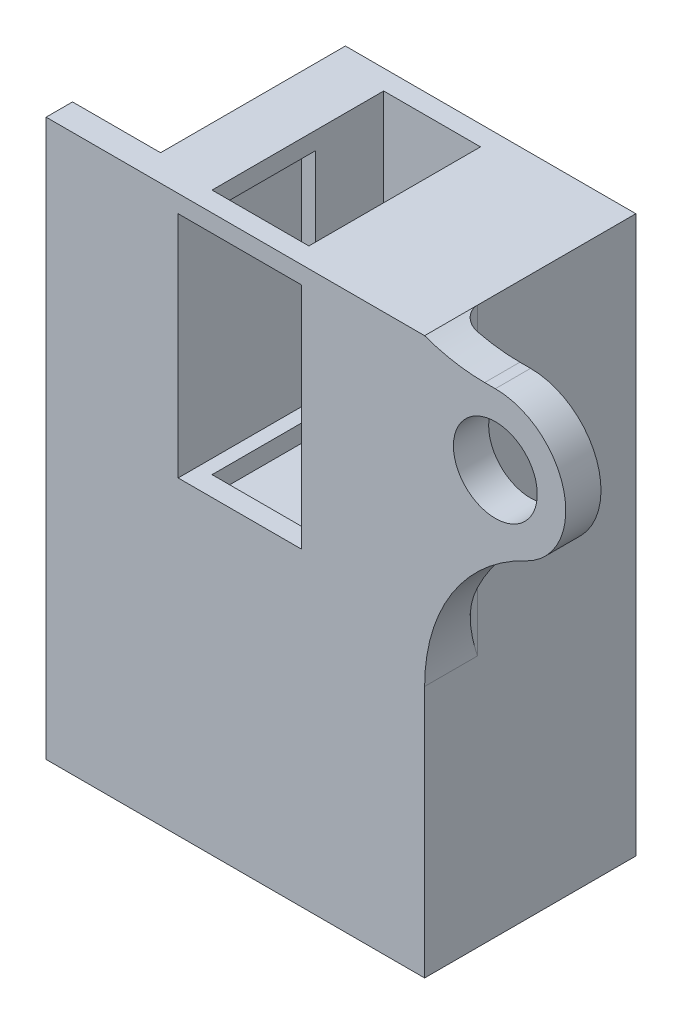
ISO-10303-21;
HEADER;
FILE_DESCRIPTION(('STEP AP214'),'2;1');
FILE_NAME('part.step','',(''),(''),'','','');
FILE_SCHEMA(('AUTOMOTIVE_DESIGN { 1 0 10303 214 1 1 1 1 }'));
ENDSEC;
DATA;
#1=APPLICATION_CONTEXT('core data for automotive mechanical design processes');
#2=APPLICATION_PROTOCOL_DEFINITION('international standard','automotive_design',2000,#1);
#3=PRODUCT_CONTEXT('',#1,'mechanical');
#4=PRODUCT('Part','Part','',(#3));
#5=PRODUCT_RELATED_PRODUCT_CATEGORY('part','',(#4));
#6=PRODUCT_DEFINITION_FORMATION('','',#4);
#7=PRODUCT_DEFINITION_CONTEXT('part definition',#1,'design');
#8=PRODUCT_DEFINITION('design','',#6,#7);
#9=PRODUCT_DEFINITION_SHAPE('','',#8);
#10=(LENGTH_UNIT() NAMED_UNIT(*) SI_UNIT(.MILLI.,.METRE.));
#11=(NAMED_UNIT(*) PLANE_ANGLE_UNIT() SI_UNIT($,.RADIAN.));
#12=(NAMED_UNIT(*) SI_UNIT($,.STERADIAN.) SOLID_ANGLE_UNIT());
#13=UNCERTAINTY_MEASURE_WITH_UNIT(LENGTH_MEASURE(1.E-05),#10,'distance_accuracy_value','');
#14=(GEOMETRIC_REPRESENTATION_CONTEXT(3) GLOBAL_UNCERTAINTY_ASSIGNED_CONTEXT((#13)) GLOBAL_UNIT_ASSIGNED_CONTEXT((#10,
#11,#12)) REPRESENTATION_CONTEXT('',''));
#15=CARTESIAN_POINT('',(0.,0.,0.));
#16=DIRECTION('',(0.,0.,1.));
#17=DIRECTION('',(1.,0.,0.));
#18=AXIS2_PLACEMENT_3D('',#15,#16,#17);
#19=CARTESIAN_POINT('',(0.,0.,-7.));
#20=DIRECTION('',(0.,0.,1.));
#21=DIRECTION('',(1.,0.,0.));
#22=AXIS2_PLACEMENT_3D('',#19,#20,#21);
#23=PLANE('',#22);
#24=DIRECTION('',(0.,-1.,0.));
#25=VECTOR('',#24,1.);
#26=CARTESIAN_POINT('',(3.3,0.,-7.));
#27=LINE('',#26,#25);
#28=CARTESIAN_POINT('',(3.3,32.6,-7.));
#29=VERTEX_POINT('',#28);
#30=CARTESIAN_POINT('',(3.3,19.6,-7.));
#31=VERTEX_POINT('',#30);
#32=EDGE_CURVE('E278',#29,#31,#27,.T.);
#33=ORIENTED_EDGE('',*,*,#32,.F.);
#34=DIRECTION('',(-1.,0.,0.));
#35=VECTOR('',#34,1.);
#36=CARTESIAN_POINT('',(0.,32.6,-7.));
#37=LINE('',#36,#35);
#38=CARTESIAN_POINT('',(2.5,32.6,-7.));
#39=VERTEX_POINT('',#38);
#40=EDGE_CURVE('E344',#29,#39,#37,.T.);
#41=ORIENTED_EDGE('',*,*,#40,.T.);
#42=DIRECTION('',(0.,-1.,0.));
#43=VECTOR('',#42,1.);
#44=CARTESIAN_POINT('',(2.50000000000001,0.,-7.));
#45=LINE('',#44,#43);
#46=CARTESIAN_POINT('',(2.5,19.6,-7.));
#47=VERTEX_POINT('',#46);
#48=EDGE_CURVE('E350',#39,#47,#45,.T.);
#49=ORIENTED_EDGE('',*,*,#48,.T.);
#50=DIRECTION('',(1.,0.,0.));
#51=VECTOR('',#50,1.);
#52=CARTESIAN_POINT('',(0.,19.6,-7.));
#53=LINE('',#52,#51);
#54=EDGE_CURVE('E355',#47,#31,#53,.T.);
#55=ORIENTED_EDGE('',*,*,#54,.T.);
#56=EDGE_LOOP('',(#33,#41,#49,#55));
#57=FACE_BOUND('',#56,.T.);
#58=ADVANCED_FACE('F42',(#57),#23,.T.);
#59=CARTESIAN_POINT('',(0.,0.,0.));
#60=DIRECTION('',(1.,0.,0.));
#61=DIRECTION('',(0.,0.,-1.));
#62=AXIS2_PLACEMENT_3D('',#59,#60,#61);
#63=PLANE('',#62);
#64=DIRECTION('',(0.,0.,1.));
#65=VECTOR('',#64,1.);
#66=CARTESIAN_POINT('',(0.,33.6,-12.));
#67=LINE('',#66,#65);
#68=CARTESIAN_POINT('',(0.,33.6,-12.));
#69=VERTEX_POINT('',#68);
#70=CARTESIAN_POINT('',(0.,33.6,-1.5));
#71=VERTEX_POINT('',#70);
#72=EDGE_CURVE('E303',#69,#71,#67,.T.);
#73=ORIENTED_EDGE('',*,*,#72,.F.);
#74=DIRECTION('',(0.,1.,0.));
#75=VECTOR('',#74,1.);
#76=CARTESIAN_POINT('',(0.,2.,-12.));
#77=LINE('',#76,#75);
#78=CARTESIAN_POINT('',(0.,2.,-12.));
#79=VERTEX_POINT('',#78);
#80=EDGE_CURVE('E287',#79,#69,#77,.T.);
#81=ORIENTED_EDGE('',*,*,#80,.F.);
#82=DIRECTION('',(0.,0.,1.));
#83=VECTOR('',#82,1.);
#84=CARTESIAN_POINT('',(0.,2.,-12.));
#85=LINE('',#84,#83);
#86=CARTESIAN_POINT('',(0.,2.,-1.5));
#87=VERTEX_POINT('',#86);
#88=EDGE_CURVE('E421',#79,#87,#85,.T.);
#89=ORIENTED_EDGE('',*,*,#88,.T.);
#90=DIRECTION('',(0.,-1.,0.));
#91=VECTOR('',#90,1.);
#92=CARTESIAN_POINT('',(0.,37.1,-1.5));
#93=LINE('',#92,#91);
#94=EDGE_CURVE('E320',#71,#87,#93,.T.);
#95=ORIENTED_EDGE('',*,*,#94,.F.);
#96=EDGE_LOOP('',(#73,#81,#89,#95));
#97=FACE_BOUND('',#96,.T.);
#98=ADVANCED_FACE('F491',(#97),#63,.F.);
#99=CARTESIAN_POINT('',(16.5,0.,0.));
#100=DIRECTION('',(0.,0.,-1.));
#101=DIRECTION('',(-1.,0.,0.));
#102=AXIS2_PLACEMENT_3D('',#99,#100,#101);
#103=PLANE('',#102);
#104=DIRECTION('',(-1.,0.,0.));
#105=VECTOR('',#104,1.);
#106=CARTESIAN_POINT('',(0.,32.6,0.));
#107=LINE('',#106,#105);
#108=CARTESIAN_POINT('',(9.5,32.6,0.));
#109=VERTEX_POINT('',#108);
#110=CARTESIAN_POINT('',(2.5,32.6,0.));
#111=VERTEX_POINT('',#110);
#112=EDGE_CURVE('E362',#109,#111,#107,.T.);
#113=ORIENTED_EDGE('',*,*,#112,.F.);
#114=DIRECTION('',(0.,1.,0.));
#115=VECTOR('',#114,1.);
#116=CARTESIAN_POINT('',(9.5,0.,0.));
#117=LINE('',#116,#115);
#118=CARTESIAN_POINT('',(9.5,19.6,0.));
#119=VERTEX_POINT('',#118);
#120=EDGE_CURVE('E339',#119,#109,#117,.T.);
#121=ORIENTED_EDGE('',*,*,#120,.F.);
#122=DIRECTION('',(1.,0.,0.));
#123=VECTOR('',#122,1.);
#124=CARTESIAN_POINT('',(0.,19.6,0.));
#125=LINE('',#124,#123);
#126=CARTESIAN_POINT('',(2.5,19.6,0.));
#127=VERTEX_POINT('',#126);
#128=EDGE_CURVE('E345',#127,#119,#125,.T.);
#129=ORIENTED_EDGE('',*,*,#128,.F.);
#130=DIRECTION('',(0.,-1.,0.));
#131=VECTOR('',#130,1.);
#132=CARTESIAN_POINT('',(2.50000000000001,0.,0.));
#133=LINE('',#132,#131);
#134=EDGE_CURVE('E366',#111,#127,#133,.T.);
#135=ORIENTED_EDGE('',*,*,#134,.F.);
#136=EDGE_LOOP('',(#113,#121,#129,#135));
#137=FACE_BOUND('',#136,.T.);
#138=CARTESIAN_POINT('',(20.5182193377738,29.,0.));
#139=DIRECTION('',(0.,0.,-1.));
#140=DIRECTION('',(-1.,0.,0.));
#141=AXIS2_PLACEMENT_3D('',#138,#139,#140);
#142=CIRCLE('',#141,2.38125);
#143=CARTESIAN_POINT('',(18.1369693377738,29.,0.));
#144=VERTEX_POINT('',#143);
#145=EDGE_CURVE('E397',#144,#144,#142,.T.);
#146=ORIENTED_EDGE('',*,*,#145,.T.);
#147=EDGE_LOOP('',(#146));
#148=FACE_BOUND('',#147,.T.);
#149=DIRECTION('',(-1.,0.,0.));
#150=VECTOR('',#149,1.);
#151=CARTESIAN_POINT('',(0.,33.,0.));
#152=LINE('',#151,#150);
#153=CARTESIAN_POINT('',(20.5182193377738,33.,0.));
#154=VERTEX_POINT('',#153);
#155=CARTESIAN_POINT('',(19.9117444218464,33.,0.));
#156=VERTEX_POINT('',#155);
#157=EDGE_CURVE('E407',#154,#156,#152,.T.);
#158=ORIENTED_EDGE('',*,*,#157,.T.);
#159=CARTESIAN_POINT('',(19.9117444218464,43.,0.));
#160=DIRECTION('',(0.,0.,-1.));
#161=DIRECTION('',(-1.,0.,0.));
#162=AXIS2_PLACEMENT_3D('',#159,#160,#161);
#163=CIRCLE('',#162,10.);
#164=CARTESIAN_POINT('',(16.5,33.6,0.));
#165=VERTEX_POINT('',#164);
#166=EDGE_CURVE('E438',#156,#165,#163,.T.);
#167=ORIENTED_EDGE('',*,*,#166,.T.);
#168=DIRECTION('',(1.,0.,0.));
#169=VECTOR('',#168,1.);
#170=CARTESIAN_POINT('',(-5.,33.6,0.));
#171=LINE('',#170,#169);
#172=CARTESIAN_POINT('',(-5.,33.6,0.));
#173=VERTEX_POINT('',#172);
#174=EDGE_CURVE('E312',#173,#165,#171,.T.);
#175=ORIENTED_EDGE('',*,*,#174,.F.);
#176=DIRECTION('',(0.,1.,0.));
#177=VECTOR('',#176,1.);
#178=CARTESIAN_POINT('',(-5.,2.,0.));
#179=LINE('',#178,#177);
#180=CARTESIAN_POINT('',(-5.,2.,0.));
#181=VERTEX_POINT('',#180);
#182=EDGE_CURVE('E321',#181,#173,#179,.T.);
#183=ORIENTED_EDGE('',*,*,#182,.F.);
#184=DIRECTION('',(1.,0.,0.));
#185=VECTOR('',#184,1.);
#186=CARTESIAN_POINT('',(0.,2.,0.));
#187=LINE('',#186,#185);
#188=CARTESIAN_POINT('',(16.5,2.,0.));
#189=VERTEX_POINT('',#188);
#190=EDGE_CURVE('E424',#181,#189,#187,.T.);
#191=ORIENTED_EDGE('',*,*,#190,.T.);
#192=DIRECTION('',(0.,-1.,0.));
#193=VECTOR('',#192,1.);
#194=CARTESIAN_POINT('',(16.5,0.,0.));
#195=LINE('',#194,#193);
#196=CARTESIAN_POINT('',(16.5,16.342263231169,0.));
#197=VERTEX_POINT('',#196);
#198=EDGE_CURVE('E430',#197,#189,#195,.T.);
#199=ORIENTED_EDGE('',*,*,#198,.F.);
#200=CARTESIAN_POINT('',(26.5,16.342263231169,0.));
#201=DIRECTION('',(0.,0.,-1.));
#202=DIRECTION('',(-1.,0.,0.));
#203=AXIS2_PLACEMENT_3D('',#200,#201,#202);
#204=CIRCLE('',#203,10.);
#205=CARTESIAN_POINT('',(22.2272995269813,25.383503780334,0.));
#206=VERTEX_POINT('',#205);
#207=EDGE_CURVE('E451',#197,#206,#204,.T.);
#208=ORIENTED_EDGE('',*,*,#207,.T.);
#209=CARTESIAN_POINT('',(20.5182193377738,29.,0.));
#210=DIRECTION('',(0.,0.,1.));
#211=DIRECTION('',(1.,0.,0.));
#212=AXIS2_PLACEMENT_3D('',#209,#210,#211);
#213=CIRCLE('',#212,4.);
#214=EDGE_CURVE('E401',#154,#206,#213,.F.);
#215=ORIENTED_EDGE('',*,*,#214,.F.);
#216=EDGE_LOOP('',(#158,#167,#175,#183,#191,#199,#208,#215));
#217=FACE_BOUND('',#216,.T.);
#218=ADVANCED_FACE('F479',(#137,#148,#217),#103,.F.);
#219=CARTESIAN_POINT('',(16.5,0.,0.));
#220=DIRECTION('',(1.,0.,0.));
#221=DIRECTION('',(0.,0.,-1.));
#222=AXIS2_PLACEMENT_3D('',#219,#220,#221);
#223=PLANE('',#222);
#224=DIRECTION('',(0.,0.,1.));
#225=VECTOR('',#224,1.);
#226=CARTESIAN_POINT('',(16.5,2.,-12.));
#227=LINE('',#226,#225);
#228=CARTESIAN_POINT('',(16.5,2.,-12.));
#229=VERTEX_POINT('',#228);
#230=EDGE_CURVE('E420',#229,#189,#227,.T.);
#231=ORIENTED_EDGE('',*,*,#230,.F.);
#232=DIRECTION('',(0.,-1.,0.));
#233=VECTOR('',#232,1.);
#234=CARTESIAN_POINT('',(16.5,2.,-12.));
#235=LINE('',#234,#233);
#236=CARTESIAN_POINT('',(16.5,33.6,-12.));
#237=VERTEX_POINT('',#236);
#238=EDGE_CURVE('E295',#237,#229,#235,.T.);
#239=ORIENTED_EDGE('',*,*,#238,.F.);
#240=DIRECTION('',(0.,0.,-1.));
#241=VECTOR('',#240,1.);
#242=CARTESIAN_POINT('',(16.5,33.6,0.));
#243=LINE('',#242,#241);
#244=CARTESIAN_POINT('',(16.5,33.6,-3.));
#245=VERTEX_POINT('',#244);
#246=EDGE_CURVE('E316',#245,#237,#243,.T.);
#247=ORIENTED_EDGE('',*,*,#246,.F.);
#248=DIRECTION('',(0.,1.,0.));
#249=VECTOR('',#248,1.);
#250=CARTESIAN_POINT('',(16.5,0.,-3.));
#251=LINE('',#250,#249);
#252=CARTESIAN_POINT('',(16.5,16.342263231169,-3.));
#253=VERTEX_POINT('',#252);
#254=EDGE_CURVE('E462',#245,#253,#251,.F.);
#255=ORIENTED_EDGE('',*,*,#254,.T.);
#256=DIRECTION('',(0.,0.,1.));
#257=VECTOR('',#256,1.);
#258=CARTESIAN_POINT('',(16.5,16.342263231169,0.));
#259=LINE('',#258,#257);
#260=EDGE_CURVE('E444',#253,#197,#259,.T.);
#261=ORIENTED_EDGE('',*,*,#260,.T.);
#262=ORIENTED_EDGE('',*,*,#198,.T.);
#263=EDGE_LOOP('',(#231,#239,#247,#255,#261,#262));
#264=FACE_BOUND('',#263,.T.);
#265=ADVANCED_FACE('F586',(#264),#223,.T.);
#266=CARTESIAN_POINT('',(0.,2.,-12.));
#267=DIRECTION('',(0.,1.,0.));
#268=DIRECTION('',(0.,0.,1.));
#269=AXIS2_PLACEMENT_3D('',#266,#267,#268);
#270=PLANE('',#269);
#271=CARTESIAN_POINT('',(8.25,2.,-6.));
#272=DIRECTION('',(0.,-1.,0.));
#273=DIRECTION('',(0.,0.,-1.));
#274=AXIS2_PLACEMENT_3D('',#271,#272,#273);
#275=CIRCLE('',#274,2.38125);
#276=CARTESIAN_POINT('',(8.25,2.,-8.38125));
#277=VERTEX_POINT('',#276);
#278=EDGE_CURVE('E376',#277,#277,#275,.T.);
#279=ORIENTED_EDGE('',*,*,#278,.F.);
#280=EDGE_LOOP('',(#279));
#281=FACE_BOUND('',#280,.T.);
#282=ORIENTED_EDGE('',*,*,#88,.F.);
#283=DIRECTION('',(-1.,0.,0.));
#284=VECTOR('',#283,1.);
#285=CARTESIAN_POINT('',(0.,2.,-12.));
#286=LINE('',#285,#284);
#287=EDGE_CURVE('E299',#229,#79,#286,.T.);
#288=ORIENTED_EDGE('',*,*,#287,.F.);
#289=ORIENTED_EDGE('',*,*,#230,.T.);
#290=ORIENTED_EDGE('',*,*,#190,.F.);
#291=DIRECTION('',(0.,0.,1.));
#292=VECTOR('',#291,1.);
#293=CARTESIAN_POINT('',(-5.,2.,-1.5));
#294=LINE('',#293,#292);
#295=CARTESIAN_POINT('',(-5.,2.,-1.5));
#296=VERTEX_POINT('',#295);
#297=EDGE_CURVE('E328',#296,#181,#294,.T.);
#298=ORIENTED_EDGE('',*,*,#297,.F.);
#299=DIRECTION('',(1.,0.,0.));
#300=VECTOR('',#299,1.);
#301=CARTESIAN_POINT('',(-5.,2.,-1.5));
#302=LINE('',#301,#300);
#303=EDGE_CURVE('E332',#296,#87,#302,.T.);
#304=ORIENTED_EDGE('',*,*,#303,.T.);
#305=EDGE_LOOP('',(#282,#288,#289,#290,#298,#304));
#306=FACE_BOUND('',#305,.T.);
#307=ADVANCED_FACE('F575',(#281,#306),#270,.F.);
#308=CARTESIAN_POINT('',(20.5182193377738,29.,-2.));
#309=DIRECTION('',(0.,0.,1.));
#310=DIRECTION('',(1.,0.,0.));
#311=AXIS2_PLACEMENT_3D('',#308,#309,#310);
#312=CYLINDRICAL_SURFACE('',#311,4.);
#313=ORIENTED_EDGE('',*,*,#214,.T.);
#314=DIRECTION('',(0.,0.,1.));
#315=VECTOR('',#314,1.);
#316=CARTESIAN_POINT('',(22.2272995269813,25.383503780334,-2.));
#317=LINE('',#316,#315);
#318=CARTESIAN_POINT('',(22.2272995269813,25.383503780334,-2.));
#319=VERTEX_POINT('',#318);
#320=EDGE_CURVE('E448',#206,#319,#317,.F.);
#321=ORIENTED_EDGE('',*,*,#320,.T.);
#322=CARTESIAN_POINT('',(20.5182193377738,29.,-2.));
#323=DIRECTION('',(0.,0.,1.));
#324=DIRECTION('',(1.,0.,0.));
#325=AXIS2_PLACEMENT_3D('',#322,#323,#324);
#326=CIRCLE('',#325,4.);
#327=CARTESIAN_POINT('',(20.5182193377738,33.,-2.));
#328=VERTEX_POINT('',#327);
#329=EDGE_CURVE('E402',#328,#319,#326,.F.);
#330=ORIENTED_EDGE('',*,*,#329,.F.);
#331=DIRECTION('',(0.,0.,1.));
#332=VECTOR('',#331,1.);
#333=CARTESIAN_POINT('',(20.5182193377738,33.,-2.));
#334=LINE('',#333,#332);
#335=EDGE_CURVE('E411',#328,#154,#334,.T.);
#336=ORIENTED_EDGE('',*,*,#335,.T.);
#337=EDGE_LOOP('',(#313,#321,#330,#336));
#338=FACE_BOUND('',#337,.T.);
#339=ADVANCED_FACE('F595',(#338),#312,.T.);
#340=CARTESIAN_POINT('',(0.,33.,-2.));
#341=DIRECTION('',(0.,1.,0.));
#342=DIRECTION('',(0.,0.,1.));
#343=AXIS2_PLACEMENT_3D('',#340,#341,#342);
#344=PLANE('',#343);
#345=DIRECTION('',(-1.,0.,0.));
#346=VECTOR('',#345,1.);
#347=CARTESIAN_POINT('',(0.,33.,-2.));
#348=LINE('',#347,#346);
#349=CARTESIAN_POINT('',(19.9117444218464,33.,-2.));
#350=VERTEX_POINT('',#349);
#351=EDGE_CURVE('E406',#328,#350,#348,.T.);
#352=ORIENTED_EDGE('',*,*,#351,.T.);
#353=DIRECTION('',(0.,0.,1.));
#354=VECTOR('',#353,1.);
#355=CARTESIAN_POINT('',(19.9117444218464,33.,0.));
#356=LINE('',#355,#354);
#357=EDGE_CURVE('E434',#350,#156,#356,.T.);
#358=ORIENTED_EDGE('',*,*,#357,.T.);
#359=ORIENTED_EDGE('',*,*,#157,.F.);
#360=ORIENTED_EDGE('',*,*,#335,.F.);
#361=EDGE_LOOP('',(#352,#358,#359,#360));
#362=FACE_BOUND('',#361,.T.);
#363=ADVANCED_FACE('F601',(#362),#344,.T.);
#364=CARTESIAN_POINT('',(0.,0.,-2.));
#365=DIRECTION('',(0.,0.,1.));
#366=DIRECTION('',(1.,0.,0.));
#367=AXIS2_PLACEMENT_3D('',#364,#365,#366);
#368=PLANE('',#367);
#369=CARTESIAN_POINT('',(20.5182193377738,29.,-2.));
#370=DIRECTION('',(0.,0.,-1.));
#371=DIRECTION('',(-1.,0.,0.));
#372=AXIS2_PLACEMENT_3D('',#369,#370,#371);
#373=CIRCLE('',#372,2.38125);
#374=CARTESIAN_POINT('',(18.1369693377738,29.,-2.));
#375=VERTEX_POINT('',#374);
#376=EDGE_CURVE('E390',#375,#375,#373,.T.);
#377=ORIENTED_EDGE('',*,*,#376,.F.);
#378=EDGE_LOOP('',(#377));
#379=FACE_BOUND('',#378,.T.);
#380=CARTESIAN_POINT('',(26.5,16.342263231169,-2.));
#381=DIRECTION('',(0.,0.,1.));
#382=DIRECTION('',(1.,0.,0.));
#383=AXIS2_PLACEMENT_3D('',#380,#381,#382);
#384=CIRCLE('',#383,10.);
#385=CARTESIAN_POINT('',(17.5,20.7011621747097,-2.));
#386=VERTEX_POINT('',#385);
#387=EDGE_CURVE('E454',#319,#386,#384,.T.);
#388=ORIENTED_EDGE('',*,*,#387,.T.);
#389=DIRECTION('',(0.,1.,0.));
#390=VECTOR('',#389,1.);
#391=CARTESIAN_POINT('',(17.5,0.,-2.));
#392=LINE('',#391,#390);
#393=CARTESIAN_POINT('',(17.5,33.2951821839,-2.));
#394=VERTEX_POINT('',#393);
#395=EDGE_CURVE('E458',#386,#394,#392,.T.);
#396=ORIENTED_EDGE('',*,*,#395,.T.);
#397=CARTESIAN_POINT('',(19.9117444218464,43.,-2.));
#398=DIRECTION('',(0.,0.,1.));
#399=DIRECTION('',(1.,0.,0.));
#400=AXIS2_PLACEMENT_3D('',#397,#398,#399);
#401=CIRCLE('',#400,10.);
#402=EDGE_CURVE('E441',#394,#350,#401,.T.);
#403=ORIENTED_EDGE('',*,*,#402,.T.);
#404=ORIENTED_EDGE('',*,*,#351,.F.);
#405=ORIENTED_EDGE('',*,*,#329,.T.);
#406=EDGE_LOOP('',(#388,#396,#403,#404,#405));
#407=FACE_BOUND('',#406,.T.);
#408=ADVANCED_FACE('F598',(#379,#407),#368,.F.);
#409=CARTESIAN_POINT('',(20.5182193377738,29.,10.6066017177982));
#410=DIRECTION('',(0.,0.,-1.));
#411=DIRECTION('',(-1.,0.,0.));
#412=AXIS2_PLACEMENT_3D('',#409,#410,#411);
#413=CYLINDRICAL_SURFACE('',#412,2.38125);
#414=ORIENTED_EDGE('',*,*,#376,.T.);
#415=EDGE_LOOP('',(#414));
#416=FACE_BOUND('',#415,.T.);
#417=ORIENTED_EDGE('',*,*,#145,.F.);
#418=EDGE_LOOP('',(#417));
#419=FACE_BOUND('',#418,.T.);
#420=ADVANCED_FACE('F608',(#416,#419),#413,.F.);
#421=CARTESIAN_POINT('',(8.25,8.35,-6.));
#422=DIRECTION('',(0.,-1.,0.));
#423=DIRECTION('',(0.,0.,-1.));
#424=AXIS2_PLACEMENT_3D('',#421,#422,#423);
#425=CYLINDRICAL_SURFACE('',#424,2.38125);
#426=CARTESIAN_POINT('',(8.25,8.35,-6.));
#427=DIRECTION('',(0.,-1.,0.));
#428=DIRECTION('',(0.,0.,-1.));
#429=AXIS2_PLACEMENT_3D('',#426,#427,#428);
#430=CIRCLE('',#429,2.38125);
#431=CARTESIAN_POINT('',(8.25,8.35,-8.38125));
#432=VERTEX_POINT('',#431);
#433=EDGE_CURVE('E386',#432,#432,#430,.T.);
#434=ORIENTED_EDGE('',*,*,#433,.F.);
#435=EDGE_LOOP('',(#434));
#436=FACE_BOUND('',#435,.T.);
#437=ORIENTED_EDGE('',*,*,#278,.T.);
#438=EDGE_LOOP('',(#437));
#439=FACE_BOUND('',#438,.T.);
#440=ADVANCED_FACE('F631',(#436,#439),#425,.F.);
#441=CARTESIAN_POINT('',(0.,8.35,0.));
#442=DIRECTION('',(0.,-1.,0.));
#443=DIRECTION('',(0.,0.,-1.));
#444=AXIS2_PLACEMENT_3D('',#441,#442,#443);
#445=PLANE('',#444);
#446=ORIENTED_EDGE('',*,*,#433,.T.);
#447=EDGE_LOOP('',(#446));
#448=FACE_BOUND('',#447,.T.);
#449=ADVANCED_FACE('F636',(#448),#445,.T.);
#450=CARTESIAN_POINT('',(9.5,0.,-7.));
#451=DIRECTION('',(1.,0.,0.));
#452=DIRECTION('',(0.,0.,-1.));
#453=AXIS2_PLACEMENT_3D('',#450,#451,#452);
#454=PLANE('',#453);
#455=ORIENTED_EDGE('',*,*,#120,.T.);
#456=DIRECTION('',(0.,0.,1.));
#457=VECTOR('',#456,1.);
#458=CARTESIAN_POINT('',(9.5,32.6,-7.));
#459=LINE('',#458,#457);
#460=CARTESIAN_POINT('',(9.5,32.6,-7.));
#461=VERTEX_POINT('',#460);
#462=EDGE_CURVE('E359',#461,#109,#459,.T.);
#463=ORIENTED_EDGE('',*,*,#462,.F.);
#464=DIRECTION('',(0.,1.,0.));
#465=VECTOR('',#464,1.);
#466=CARTESIAN_POINT('',(9.5,0.,-7.));
#467=LINE('',#466,#465);
#468=CARTESIAN_POINT('',(9.5,19.6,-7.));
#469=VERTEX_POINT('',#468);
#470=EDGE_CURVE('E340',#469,#461,#467,.T.);
#471=ORIENTED_EDGE('',*,*,#470,.F.);
#472=DIRECTION('',(0.,0.,1.));
#473=VECTOR('',#472,1.);
#474=CARTESIAN_POINT('',(9.5,19.6,-7.));
#475=LINE('',#474,#473);
#476=EDGE_CURVE('E373',#469,#119,#475,.T.);
#477=ORIENTED_EDGE('',*,*,#476,.T.);
#478=EDGE_LOOP('',(#455,#463,#471,#477));
#479=FACE_BOUND('',#478,.T.);
#480=ADVANCED_FACE('F642',(#479),#454,.F.);
#481=CARTESIAN_POINT('',(0.,19.6,-7.));
#482=DIRECTION('',(0.,-1.,0.));
#483=DIRECTION('',(0.,0.,-1.));
#484=AXIS2_PLACEMENT_3D('',#481,#482,#483);
#485=PLANE('',#484);
#486=DIRECTION('',(-1.,0.,0.));
#487=VECTOR('',#486,1.);
#488=CARTESIAN_POINT('',(0.,19.6,-1.125));
#489=LINE('',#488,#487);
#490=CARTESIAN_POINT('',(8.8,19.6,-1.125));
#491=VERTEX_POINT('',#490);
#492=CARTESIAN_POINT('',(3.3,19.6,-1.125));
#493=VERTEX_POINT('',#492);
#494=EDGE_CURVE('E266',#491,#493,#489,.T.);
#495=ORIENTED_EDGE('',*,*,#494,.T.);
#496=DIRECTION('',(0.,0.,-1.));
#497=VECTOR('',#496,1.);
#498=CARTESIAN_POINT('',(3.3,19.6,-7.));
#499=LINE('',#498,#497);
#500=EDGE_CURVE('E213',#493,#31,#499,.T.);
#501=ORIENTED_EDGE('',*,*,#500,.T.);
#502=ORIENTED_EDGE('',*,*,#54,.F.);
#503=DIRECTION('',(0.,0.,1.));
#504=VECTOR('',#503,1.);
#505=CARTESIAN_POINT('',(2.5,19.6,-7.));
#506=LINE('',#505,#504);
#507=EDGE_CURVE('E377',#47,#127,#506,.T.);
#508=ORIENTED_EDGE('',*,*,#507,.T.);
#509=ORIENTED_EDGE('',*,*,#128,.T.);
#510=ORIENTED_EDGE('',*,*,#476,.F.);
#511=CARTESIAN_POINT('',(8.8,19.6,-7.));
#512=VERTEX_POINT('',#511);
#513=EDGE_CURVE('E354',#512,#469,#53,.T.);
#514=ORIENTED_EDGE('',*,*,#513,.F.);
#515=DIRECTION('',(0.,0.,1.));
#516=VECTOR('',#515,1.);
#517=CARTESIAN_POINT('',(8.8,19.6,-7.));
#518=LINE('',#517,#516);
#519=EDGE_CURVE('E63',#512,#491,#518,.T.);
#520=ORIENTED_EDGE('',*,*,#519,.T.);
#521=EDGE_LOOP('',(#495,#501,#502,#508,#509,#510,#514,#520));
#522=FACE_BOUND('',#521,.T.);
#523=ADVANCED_FACE('F522',(#522),#485,.F.);
#524=CARTESIAN_POINT('',(2.50000000000001,0.,-7.));
#525=DIRECTION('',(-1.,0.,0.));
#526=DIRECTION('',(0.,-1.,0.));
#527=AXIS2_PLACEMENT_3D('',#524,#525,#526);
#528=PLANE('',#527);
#529=ORIENTED_EDGE('',*,*,#134,.T.);
#530=ORIENTED_EDGE('',*,*,#507,.F.);
#531=ORIENTED_EDGE('',*,*,#48,.F.);
#532=DIRECTION('',(0.,0.,1.));
#533=VECTOR('',#532,1.);
#534=CARTESIAN_POINT('',(2.5,32.6,-7.));
#535=LINE('',#534,#533);
#536=EDGE_CURVE('E380',#39,#111,#535,.T.);
#537=ORIENTED_EDGE('',*,*,#536,.T.);
#538=EDGE_LOOP('',(#529,#530,#531,#537));
#539=FACE_BOUND('',#538,.T.);
#540=ADVANCED_FACE('F515',(#539),#528,.F.);
#541=CARTESIAN_POINT('',(0.,32.6,-7.));
#542=DIRECTION('',(0.,1.,0.));
#543=DIRECTION('',(0.,0.,1.));
#544=AXIS2_PLACEMENT_3D('',#541,#542,#543);
#545=PLANE('',#544);
#546=ORIENTED_EDGE('',*,*,#40,.F.);
#547=DIRECTION('',(0.,0.,1.));
#548=VECTOR('',#547,1.);
#549=CARTESIAN_POINT('',(3.3,32.6,-7.));
#550=LINE('',#549,#548);
#551=CARTESIAN_POINT('',(3.3,32.6,-1.125));
#552=VERTEX_POINT('',#551);
#553=EDGE_CURVE('E281',#29,#552,#550,.T.);
#554=ORIENTED_EDGE('',*,*,#553,.T.);
#555=DIRECTION('',(1.,0.,0.));
#556=VECTOR('',#555,1.);
#557=CARTESIAN_POINT('',(0.,32.6,-1.125));
#558=LINE('',#557,#556);
#559=CARTESIAN_POINT('',(8.8,32.6,-1.125));
#560=VERTEX_POINT('',#559);
#561=EDGE_CURVE('E257',#552,#560,#558,.T.);
#562=ORIENTED_EDGE('',*,*,#561,.T.);
#563=DIRECTION('',(0.,0.,-1.));
#564=VECTOR('',#563,1.);
#565=CARTESIAN_POINT('',(8.8,32.6,-7.));
#566=LINE('',#565,#564);
#567=CARTESIAN_POINT('',(8.8,32.6,-7.));
#568=VERTEX_POINT('',#567);
#569=EDGE_CURVE('E272',#560,#568,#566,.T.);
#570=ORIENTED_EDGE('',*,*,#569,.T.);
#571=EDGE_CURVE('E346',#461,#568,#37,.T.);
#572=ORIENTED_EDGE('',*,*,#571,.F.);
#573=ORIENTED_EDGE('',*,*,#462,.T.);
#574=ORIENTED_EDGE('',*,*,#112,.T.);
#575=ORIENTED_EDGE('',*,*,#536,.F.);
#576=EDGE_LOOP('',(#546,#554,#562,#570,#572,#573,#574,#575));
#577=FACE_BOUND('',#576,.T.);
#578=ADVANCED_FACE('F506',(#577),#545,.F.);
#579=DIRECTION('',(0.,1.,0.));
#580=VECTOR('',#579,1.);
#581=CARTESIAN_POINT('',(8.8,0.,-7.));
#582=LINE('',#581,#580);
#583=EDGE_CURVE('E269',#512,#568,#582,.T.);
#584=ORIENTED_EDGE('',*,*,#583,.F.);
#585=ORIENTED_EDGE('',*,*,#513,.T.);
#586=ORIENTED_EDGE('',*,*,#470,.T.);
#587=ORIENTED_EDGE('',*,*,#571,.T.);
#588=EDGE_LOOP('',(#584,#585,#586,#587));
#589=FACE_BOUND('',#588,.T.);
#590=ADVANCED_FACE('F494',(#589),#23,.T.);
#591=CARTESIAN_POINT('',(-5.,37.1,-1.5));
#592=DIRECTION('',(0.,0.,1.));
#593=DIRECTION('',(0.,-1.,0.));
#594=AXIS2_PLACEMENT_3D('',#591,#592,#593);
#595=PLANE('',#594);
#596=DIRECTION('',(0.,-1.,0.));
#597=VECTOR('',#596,1.);
#598=CARTESIAN_POINT('',(-5.,37.1,-1.5));
#599=LINE('',#598,#597);
#600=CARTESIAN_POINT('',(-5.,33.6,-1.5));
#601=VERTEX_POINT('',#600);
#602=EDGE_CURVE('E325',#601,#296,#599,.T.);
#603=ORIENTED_EDGE('',*,*,#602,.F.);
#604=DIRECTION('',(-1.,0.,0.));
#605=VECTOR('',#604,1.);
#606=CARTESIAN_POINT('',(0.,33.6,-1.5));
#607=LINE('',#606,#605);
#608=EDGE_CURVE('E306',#71,#601,#607,.T.);
#609=ORIENTED_EDGE('',*,*,#608,.F.);
#610=ORIENTED_EDGE('',*,*,#94,.T.);
#611=ORIENTED_EDGE('',*,*,#303,.F.);
#612=EDGE_LOOP('',(#603,#609,#610,#611));
#613=FACE_BOUND('',#612,.T.);
#614=ADVANCED_FACE('F505',(#613),#595,.F.);
#615=CARTESIAN_POINT('',(-5.,0.,0.));
#616=DIRECTION('',(-1.,0.,0.));
#617=DIRECTION('',(0.,0.,1.));
#618=AXIS2_PLACEMENT_3D('',#615,#616,#617);
#619=PLANE('',#618);
#620=DIRECTION('',(0.,0.,1.));
#621=VECTOR('',#620,1.);
#622=CARTESIAN_POINT('',(-5.,33.6,-1.5));
#623=LINE('',#622,#621);
#624=EDGE_CURVE('E309',#601,#173,#623,.T.);
#625=ORIENTED_EDGE('',*,*,#624,.F.);
#626=ORIENTED_EDGE('',*,*,#602,.T.);
#627=ORIENTED_EDGE('',*,*,#297,.T.);
#628=ORIENTED_EDGE('',*,*,#182,.T.);
#629=EDGE_LOOP('',(#625,#626,#627,#628));
#630=FACE_BOUND('',#629,.T.);
#631=ADVANCED_FACE('F513',(#630),#619,.T.);
#632=CARTESIAN_POINT('',(0.,33.6,0.));
#633=DIRECTION('',(0.,-1.,0.));
#634=DIRECTION('',(0.,0.,-1.));
#635=AXIS2_PLACEMENT_3D('',#632,#633,#634);
#636=PLANE('',#635);
#637=DIRECTION('',(1.,0.,0.));
#638=VECTOR('',#637,1.);
#639=CARTESIAN_POINT('',(3.3,33.6,-1.125));
#640=LINE('',#639,#638);
#641=CARTESIAN_POINT('',(3.3,33.6,-1.125));
#642=VERTEX_POINT('',#641);
#643=CARTESIAN_POINT('',(8.8,33.6,-1.125));
#644=VERTEX_POINT('',#643);
#645=EDGE_CURVE('E247',#642,#644,#640,.T.);
#646=ORIENTED_EDGE('',*,*,#645,.F.);
#647=DIRECTION('',(0.,0.,1.));
#648=VECTOR('',#647,1.);
#649=CARTESIAN_POINT('',(3.3,33.6,-10.875));
#650=LINE('',#649,#648);
#651=CARTESIAN_POINT('',(3.3,33.6,-10.875));
#652=VERTEX_POINT('',#651);
#653=EDGE_CURVE('E71',#652,#642,#650,.T.);
#654=ORIENTED_EDGE('',*,*,#653,.F.);
#655=DIRECTION('',(-1.,0.,0.));
#656=VECTOR('',#655,1.);
#657=CARTESIAN_POINT('',(3.3,33.6,-10.875));
#658=LINE('',#657,#656);
#659=CARTESIAN_POINT('',(8.8,33.6,-10.875));
#660=VERTEX_POINT('',#659);
#661=EDGE_CURVE('E234',#660,#652,#658,.T.);
#662=ORIENTED_EDGE('',*,*,#661,.F.);
#663=DIRECTION('',(0.,0.,-1.));
#664=VECTOR('',#663,1.);
#665=CARTESIAN_POINT('',(8.8,33.6,-10.875));
#666=LINE('',#665,#664);
#667=EDGE_CURVE('E238',#644,#660,#666,.T.);
#668=ORIENTED_EDGE('',*,*,#667,.F.);
#669=EDGE_LOOP('',(#646,#654,#662,#668));
#670=FACE_BOUND('',#669,.T.);
#671=ORIENTED_EDGE('',*,*,#246,.T.);
#672=DIRECTION('',(1.,0.,0.));
#673=VECTOR('',#672,1.);
#674=CARTESIAN_POINT('',(0.,33.6,-12.));
#675=LINE('',#674,#673);
#676=EDGE_CURVE('E291',#69,#237,#675,.T.);
#677=ORIENTED_EDGE('',*,*,#676,.F.);
#678=ORIENTED_EDGE('',*,*,#72,.T.);
#679=ORIENTED_EDGE('',*,*,#608,.T.);
#680=ORIENTED_EDGE('',*,*,#624,.T.);
#681=ORIENTED_EDGE('',*,*,#174,.T.);
#682=EDGE_CURVE('E317',#165,#245,#243,.T.);
#683=ORIENTED_EDGE('',*,*,#682,.T.);
#684=EDGE_LOOP('',(#671,#677,#678,#679,#680,#681,#683));
#685=FACE_BOUND('',#684,.T.);
#686=ADVANCED_FACE('F477',(#670,#685),#636,.F.);
#687=CARTESIAN_POINT('',(19.9117444218464,43.,0.));
#688=DIRECTION('',(0.,0.,-1.));
#689=DIRECTION('',(-1.,0.,0.));
#690=AXIS2_PLACEMENT_3D('',#687,#688,#689);
#691=CYLINDRICAL_SURFACE('',#690,10.);
#692=ORIENTED_EDGE('',*,*,#402,.F.);
#693=CARTESIAN_POINT('',(17.5,33.2951821839,-2.));
#694=CARTESIAN_POINT('',(17.4416882046076,33.3096521513916,-1.99996377159555));
#695=CARTESIAN_POINT('',(17.3835448570359,33.3246797672575,-2.00509729641203));
#696=CARTESIAN_POINT('',(17.2691894306341,33.3552970068834,-2.02528178802682));
#697=CARTESIAN_POINT('',(17.2129763122904,33.370886318572,-2.04032732575709));
#698=CARTESIAN_POINT('',(17.1039998442129,33.4020931624776,-2.07991778830303));
#699=CARTESIAN_POINT('',(17.0512370422384,33.417710698773,-2.10446421718611));
#700=CARTESIAN_POINT('',(16.9506212007074,33.4483242872222,-2.16241344629458));
#701=CARTESIAN_POINT('',(16.9027678199665,33.4633203825204,-2.19581563050275));
#702=CARTESIAN_POINT('',(16.8133948734528,33.4919804261872,-2.27063887890849));
#703=CARTESIAN_POINT('',(16.7718704395181,33.5056453954947,-2.31205372362896));
#704=CARTESIAN_POINT('',(16.6964431848553,33.5309227438538,-2.40189151600445));
#705=CARTESIAN_POINT('',(16.6625404522537,33.5425350991717,-2.45031454468144));
#706=CARTESIAN_POINT('',(16.6046947097274,33.5626100803941,-2.55092090933748));
#707=CARTESIAN_POINT('',(16.5804299370159,33.5711732462641,-2.60289915195508));
#708=CARTESIAN_POINT('',(16.5410873005675,33.5851653108669,-2.71058607085887));
#709=CARTESIAN_POINT('',(16.5259962909772,33.590598693939,-2.76628928157378));
#710=CARTESIAN_POINT('',(16.5105487685177,33.5961765065227,-2.85211540040821));
#711=CARTESIAN_POINT('',(16.5065958447039,33.5976080034534,-2.88155237267648));
#712=CARTESIAN_POINT('',(16.5013224671775,33.5995199180946,-2.94065406686891));
#713=CARTESIAN_POINT('',(16.4999986917682,33.600001535888,-2.97031845382046));
#714=CARTESIAN_POINT('',(16.5,33.6,-3.));
#715=B_SPLINE_CURVE_WITH_KNOTS('',3,(#693,#694,#695,#696,#697,#698,#699,#700,#701,#702,#703,
#704,#705,#706,#707,#708,#709,#710,#711,#712,#713,#714),.UNSPECIFIED.,.F.,.F.,(4,2,2,2,2,2,2,2,
2,2,4),(0.,0.179979391065258,0.359860284590325,0.539769666360691,0.719666536695732,
0.899424326151548,1.07918419396243,1.25230100574518,1.42516915555092,1.51425951775296,
1.60323725036706),.UNSPECIFIED.);
#716=EDGE_CURVE('E56',#394,#245,#715,.T.);
#717=ORIENTED_EDGE('',*,*,#716,.T.);
#718=ORIENTED_EDGE('',*,*,#682,.F.);
#719=ORIENTED_EDGE('',*,*,#166,.F.);
#720=ORIENTED_EDGE('',*,*,#357,.F.);
#721=EDGE_LOOP('',(#692,#717,#718,#719,#720));
#722=FACE_BOUND('',#721,.T.);
#723=ADVANCED_FACE('F472',(#722),#691,.F.);
#724=CARTESIAN_POINT('',(26.5,16.342263231169,-2.));
#725=DIRECTION('',(0.,0.,1.));
#726=DIRECTION('',(1.,0.,0.));
#727=AXIS2_PLACEMENT_3D('',#724,#725,#726);
#728=CYLINDRICAL_SURFACE('',#727,10.);
#729=ORIENTED_EDGE('',*,*,#387,.F.);
#730=ORIENTED_EDGE('',*,*,#320,.F.);
#731=ORIENTED_EDGE('',*,*,#207,.F.);
#732=ORIENTED_EDGE('',*,*,#260,.F.);
#733=CARTESIAN_POINT('',(17.5,20.7011621747097,-2.));
#734=CARTESIAN_POINT('',(17.4649705918882,20.6288396959497,-2.00001517907888));
#735=CARTESIAN_POINT('',(17.4308249738421,20.556111587016,-2.00183974990828));
#736=CARTESIAN_POINT('',(17.3643618176126,20.4100074789031,-2.00867500405915));
#737=CARTESIAN_POINT('',(17.3320435036572,20.336631770189,-2.01368432408378));
#738=CARTESIAN_POINT('',(17.2693266347427,20.1894773913306,-2.02644469931918));
#739=CARTESIAN_POINT('',(17.2389244580283,20.1156997864008,-2.03419038738089));
#740=CARTESIAN_POINT('',(17.1799867691033,19.9676874000717,-2.05208658188006));
#741=CARTESIAN_POINT('',(17.1514514850332,19.8934525640055,-2.06223738153228));
#742=CARTESIAN_POINT('',(17.0688926274996,19.6708057930277,-2.09574919733705));
#743=CARTESIAN_POINT('',(17.017647311377,19.5218199539269,-2.12222969644671));
#744=CARTESIAN_POINT('',(16.9225479634451,19.2227266295524,-2.18165298985507));
#745=CARTESIAN_POINT('',(16.8786986935253,19.0726184861419,-2.21459991820859));
#746=CARTESIAN_POINT('',(16.7820109335453,18.7105191846494,-2.29987772594522));
#747=CARTESIAN_POINT('',(16.732746945945,18.4981381547551,-2.35464870463528));
#748=CARTESIAN_POINT('',(16.6484261900647,18.0724702024824,-2.47087286474006));
#749=CARTESIAN_POINT('',(16.6133715529952,17.8591831490567,-2.53232704679311));
#750=CARTESIAN_POINT('',(16.5291314236184,17.2182827355187,-2.72300296786534));
#751=CARTESIAN_POINT('',(16.5008343674646,16.7894961375238,-2.85857288785149));
#752=CARTESIAN_POINT('',(16.5000060646769,16.3549759307317,-2.99597991124583));
#753=CARTESIAN_POINT('',(16.5000000044712,16.3486195087201,-2.99798998882368));
#754=CARTESIAN_POINT('',(16.5,16.342263231169,-3.));
#755=B_SPLINE_CURVE_WITH_KNOTS('',3,(#733,#734,#735,#736,#737,#738,#739,#740,#741,#742,#743,
#744,#745,#746,#747,#748,#749,#750,#751,#752,#753,#754),.UNSPECIFIED.,.F.,.F.,(4,2,2,2,2,2,2,2,
2,2,4),(0.,0.241022397911186,0.481941690674264,0.722391040963445,0.962869720289598,
1.44176483881817,1.92096712310371,2.59465687968437,3.26844764326604,4.61560355969885,
4.63560356796335),.UNSPECIFIED.);
#756=EDGE_CURVE('E11',#253,#386,#755,.F.);
#757=ORIENTED_EDGE('',*,*,#756,.T.);
#758=EDGE_LOOP('',(#729,#730,#731,#732,#757));
#759=FACE_BOUND('',#758,.T.);
#760=ADVANCED_FACE('F476',(#759),#728,.F.);
#761=CARTESIAN_POINT('',(17.5,0.,-3.));
#762=DIRECTION('',(0.,1.,0.));
#763=DIRECTION('',(0.,0.,1.));
#764=AXIS2_PLACEMENT_3D('',#761,#762,#763);
#765=CYLINDRICAL_SURFACE('',#764,1.);
#766=ORIENTED_EDGE('',*,*,#756,.F.);
#767=ORIENTED_EDGE('',*,*,#254,.F.);
#768=ORIENTED_EDGE('',*,*,#716,.F.);
#769=ORIENTED_EDGE('',*,*,#395,.F.);
#770=EDGE_LOOP('',(#766,#767,#768,#769));
#771=FACE_BOUND('',#770,.T.);
#772=ADVANCED_FACE('F44',(#771),#765,.F.);
#773=CARTESIAN_POINT('',(0.,0.,-12.));
#774=DIRECTION('',(0.,0.,-1.));
#775=DIRECTION('',(-1.,0.,0.));
#776=AXIS2_PLACEMENT_3D('',#773,#774,#775);
#777=PLANE('',#776);
#778=ORIENTED_EDGE('',*,*,#80,.T.);
#779=ORIENTED_EDGE('',*,*,#676,.T.);
#780=ORIENTED_EDGE('',*,*,#238,.T.);
#781=ORIENTED_EDGE('',*,*,#287,.T.);
#782=EDGE_LOOP('',(#778,#779,#780,#781));
#783=FACE_BOUND('',#782,.T.);
#784=ADVANCED_FACE('F487',(#783),#777,.T.);
#785=CARTESIAN_POINT('',(3.3,18.6,-10.875));
#786=DIRECTION('',(-1.,0.,0.));
#787=DIRECTION('',(0.,0.,1.));
#788=AXIS2_PLACEMENT_3D('',#785,#786,#787);
#789=PLANE('',#788);
#790=DIRECTION('',(0.,1.,0.));
#791=VECTOR('',#790,1.);
#792=CARTESIAN_POINT('',(3.3,18.6,-1.125));
#793=LINE('',#792,#791);
#794=CARTESIAN_POINT('',(3.3,18.6,-1.125));
#795=VERTEX_POINT('',#794);
#796=EDGE_CURVE('E206',#795,#493,#793,.T.);
#797=ORIENTED_EDGE('',*,*,#796,.F.);
#798=DIRECTION('',(0.,0.,1.));
#799=VECTOR('',#798,1.);
#800=CARTESIAN_POINT('',(3.3,18.6,-10.875));
#801=LINE('',#800,#799);
#802=CARTESIAN_POINT('',(3.3,18.6,-10.875));
#803=VERTEX_POINT('',#802);
#804=EDGE_CURVE('E210',#803,#795,#801,.T.);
#805=ORIENTED_EDGE('',*,*,#804,.F.);
#806=DIRECTION('',(0.,1.,0.));
#807=VECTOR('',#806,1.);
#808=CARTESIAN_POINT('',(3.3,18.6,-10.875));
#809=LINE('',#808,#807);
#810=EDGE_CURVE('E254',#803,#652,#809,.T.);
#811=ORIENTED_EDGE('',*,*,#810,.T.);
#812=ORIENTED_EDGE('',*,*,#653,.T.);
#813=EDGE_CURVE('E218',#552,#642,#793,.T.);
#814=ORIENTED_EDGE('',*,*,#813,.F.);
#815=ORIENTED_EDGE('',*,*,#553,.F.);
#816=ORIENTED_EDGE('',*,*,#32,.T.);
#817=ORIENTED_EDGE('',*,*,#500,.F.);
#818=EDGE_LOOP('',(#797,#805,#811,#812,#814,#815,#816,#817));
#819=FACE_BOUND('',#818,.T.);
#820=ADVANCED_FACE('F208',(#819),#789,.F.);
#821=CARTESIAN_POINT('',(8.8,18.6,-10.875));
#822=DIRECTION('',(1.,0.,0.));
#823=DIRECTION('',(0.,0.,-1.));
#824=AXIS2_PLACEMENT_3D('',#821,#822,#823);
#825=PLANE('',#824);
#826=ORIENTED_EDGE('',*,*,#583,.T.);
#827=ORIENTED_EDGE('',*,*,#569,.F.);
#828=DIRECTION('',(0.,1.,0.));
#829=VECTOR('',#828,1.);
#830=CARTESIAN_POINT('',(8.8,18.6,-1.125));
#831=LINE('',#830,#829);
#832=EDGE_CURVE('E217',#560,#644,#831,.T.);
#833=ORIENTED_EDGE('',*,*,#832,.T.);
#834=ORIENTED_EDGE('',*,*,#667,.T.);
#835=DIRECTION('',(0.,1.,0.));
#836=VECTOR('',#835,1.);
#837=CARTESIAN_POINT('',(8.8,18.6,-10.875));
#838=LINE('',#837,#836);
#839=CARTESIAN_POINT('',(8.8,18.6,-10.875));
#840=VERTEX_POINT('',#839);
#841=EDGE_CURVE('E258',#840,#660,#838,.T.);
#842=ORIENTED_EDGE('',*,*,#841,.F.);
#843=DIRECTION('',(0.,0.,-1.));
#844=VECTOR('',#843,1.);
#845=CARTESIAN_POINT('',(8.8,18.6,-10.875));
#846=LINE('',#845,#844);
#847=CARTESIAN_POINT('',(8.8,18.6,-1.125));
#848=VERTEX_POINT('',#847);
#849=EDGE_CURVE('E228',#848,#840,#846,.T.);
#850=ORIENTED_EDGE('',*,*,#849,.F.);
#851=EDGE_CURVE('E223',#848,#491,#831,.T.);
#852=ORIENTED_EDGE('',*,*,#851,.T.);
#853=ORIENTED_EDGE('',*,*,#519,.F.);
#854=EDGE_LOOP('',(#826,#827,#833,#834,#842,#850,#852,#853));
#855=FACE_BOUND('',#854,.T.);
#856=ADVANCED_FACE('F537',(#855),#825,.F.);
#857=CARTESIAN_POINT('',(3.3,18.6,-1.125));
#858=DIRECTION('',(0.,0.,1.));
#859=DIRECTION('',(1.,0.,0.));
#860=AXIS2_PLACEMENT_3D('',#857,#858,#859);
#861=PLANE('',#860);
#862=ORIENTED_EDGE('',*,*,#851,.F.);
#863=DIRECTION('',(1.,0.,0.));
#864=VECTOR('',#863,1.);
#865=CARTESIAN_POINT('',(3.3,18.6,-1.125));
#866=LINE('',#865,#864);
#867=EDGE_CURVE('E221',#795,#848,#866,.T.);
#868=ORIENTED_EDGE('',*,*,#867,.F.);
#869=ORIENTED_EDGE('',*,*,#796,.T.);
#870=ORIENTED_EDGE('',*,*,#494,.F.);
#871=EDGE_LOOP('',(#862,#868,#869,#870));
#872=FACE_BOUND('',#871,.T.);
#873=ADVANCED_FACE('F222',(#872),#861,.F.);
#874=ORIENTED_EDGE('',*,*,#813,.T.);
#875=ORIENTED_EDGE('',*,*,#645,.T.);
#876=ORIENTED_EDGE('',*,*,#832,.F.);
#877=ORIENTED_EDGE('',*,*,#561,.F.);
#878=EDGE_LOOP('',(#874,#875,#876,#877));
#879=FACE_BOUND('',#878,.T.);
#880=ADVANCED_FACE('F531',(#879),#861,.F.);
#881=CARTESIAN_POINT('',(3.3,18.6,-10.875));
#882=DIRECTION('',(0.,0.,-1.));
#883=DIRECTION('',(-1.,0.,0.));
#884=AXIS2_PLACEMENT_3D('',#881,#882,#883);
#885=PLANE('',#884);
#886=ORIENTED_EDGE('',*,*,#661,.T.);
#887=ORIENTED_EDGE('',*,*,#810,.F.);
#888=DIRECTION('',(-1.,0.,0.));
#889=VECTOR('',#888,1.);
#890=CARTESIAN_POINT('',(3.3,18.6,-10.875));
#891=LINE('',#890,#889);
#892=EDGE_CURVE('E232',#840,#803,#891,.T.);
#893=ORIENTED_EDGE('',*,*,#892,.F.);
#894=ORIENTED_EDGE('',*,*,#841,.T.);
#895=EDGE_LOOP('',(#886,#887,#893,#894));
#896=FACE_BOUND('',#895,.T.);
#897=ADVANCED_FACE('F543',(#896),#885,.F.);
#898=CARTESIAN_POINT('',(0.,18.6,0.));
#899=DIRECTION('',(0.,1.,0.));
#900=DIRECTION('',(0.,0.,1.));
#901=AXIS2_PLACEMENT_3D('',#898,#899,#900);
#902=PLANE('',#901);
#903=ORIENTED_EDGE('',*,*,#804,.T.);
#904=ORIENTED_EDGE('',*,*,#867,.T.);
#905=ORIENTED_EDGE('',*,*,#849,.T.);
#906=ORIENTED_EDGE('',*,*,#892,.T.);
#907=EDGE_LOOP('',(#903,#904,#905,#906));
#908=FACE_BOUND('',#907,.T.);
#909=ADVANCED_FACE('F230',(#908),#902,.T.);
#910=CLOSED_SHELL('',(#58,#98,#218,#265,#307,#339,#363,#408,#420,#440,#449,#480,#523,#540,#578,
#590,#614,#631,#686,#723,#760,#772,#784,#820,#856,#873,#880,#897,#909));
#911=MANIFOLD_SOLID_BREP('B2',#910);
#912=ADVANCED_BREP_SHAPE_REPRESENTATION('',(#18,#911),#14);
#913=SHAPE_DEFINITION_REPRESENTATION(#9,#912);
ENDSEC;
END-ISO-10303-21;
